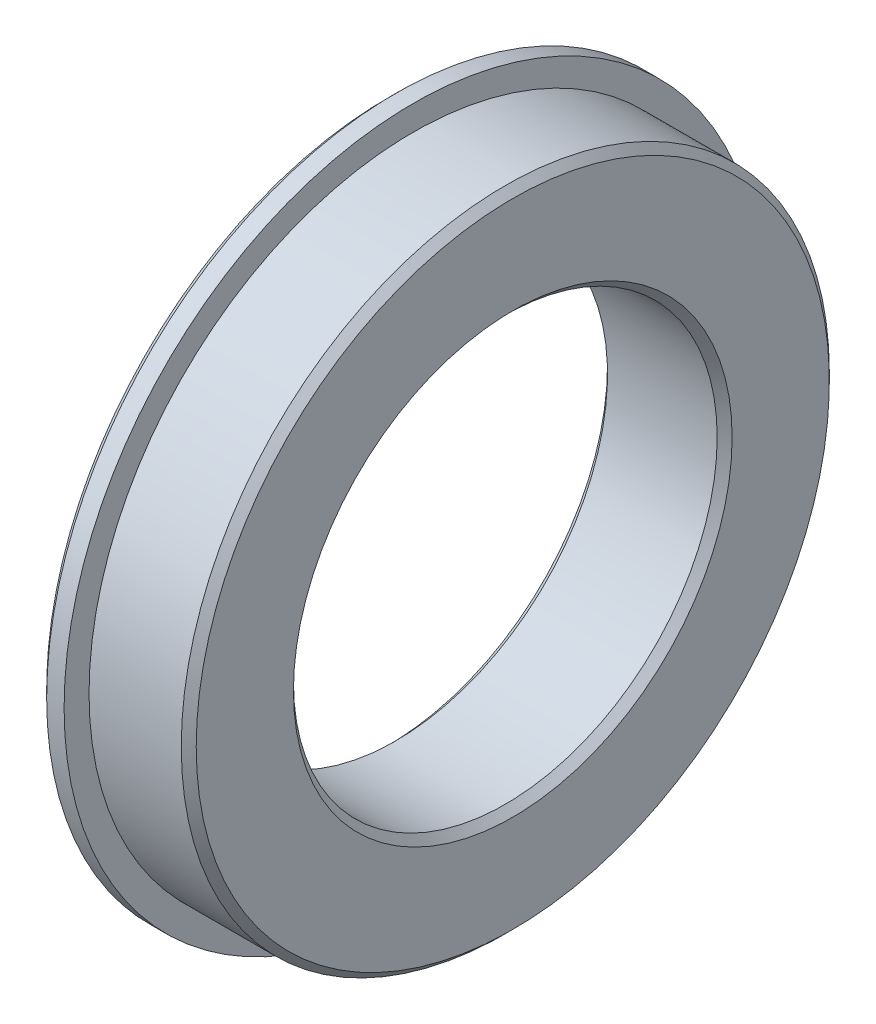
ISO-10303-21;
HEADER;
FILE_DESCRIPTION(('STEP AP214'),'2;1');
FILE_NAME('part.step','',(''),(''),'','','');
FILE_SCHEMA(('AUTOMOTIVE_DESIGN { 1 0 10303 214 1 1 1 1 }'));
ENDSEC;
DATA;
#1=APPLICATION_CONTEXT('core data for automotive mechanical design processes');
#2=APPLICATION_PROTOCOL_DEFINITION('international standard','automotive_design',2000,#1);
#3=PRODUCT_CONTEXT('',#1,'mechanical');
#4=PRODUCT('Part','Part','',(#3));
#5=PRODUCT_RELATED_PRODUCT_CATEGORY('part','',(#4));
#6=PRODUCT_DEFINITION_FORMATION('','',#4);
#7=PRODUCT_DEFINITION_CONTEXT('part definition',#1,'design');
#8=PRODUCT_DEFINITION('design','',#6,#7);
#9=PRODUCT_DEFINITION_SHAPE('','',#8);
#10=(LENGTH_UNIT() NAMED_UNIT(*) SI_UNIT(.MILLI.,.METRE.));
#11=(NAMED_UNIT(*) PLANE_ANGLE_UNIT() SI_UNIT($,.RADIAN.));
#12=(NAMED_UNIT(*) SI_UNIT($,.STERADIAN.) SOLID_ANGLE_UNIT());
#13=UNCERTAINTY_MEASURE_WITH_UNIT(LENGTH_MEASURE(1.E-05),#10,'distance_accuracy_value','');
#14=(GEOMETRIC_REPRESENTATION_CONTEXT(3) GLOBAL_UNCERTAINTY_ASSIGNED_CONTEXT((#13)) GLOBAL_UNIT_ASSIGNED_CONTEXT((#10,
#11,#12)) REPRESENTATION_CONTEXT('',''));
#15=CARTESIAN_POINT('',(0.,0.,0.));
#16=DIRECTION('',(0.,0.,1.));
#17=DIRECTION('',(1.,0.,0.));
#18=AXIS2_PLACEMENT_3D('',#15,#16,#17);
#19=CARTESIAN_POINT('',(5.,0.,0.));
#20=DIRECTION('',(1.,0.,0.));
#21=DIRECTION('',(0.,0.,-1.));
#22=AXIS2_PLACEMENT_3D('',#19,#20,#21);
#23=PLANE('',#22);
#24=CARTESIAN_POINT('',(5.,0.,0.));
#25=DIRECTION('',(1.,0.,0.));
#26=DIRECTION('',(0.,0.,-1.));
#27=AXIS2_PLACEMENT_3D('',#24,#25,#26);
#28=CIRCLE('',#27,12.7);
#29=CARTESIAN_POINT('',(5.,0.,12.7));
#30=VERTEX_POINT('',#29);
#31=EDGE_CURVE('E58',#30,#30,#28,.T.);
#32=ORIENTED_EDGE('',*,*,#31,.T.);
#33=EDGE_LOOP('',(#32));
#34=FACE_BOUND('',#33,.T.);
#35=CARTESIAN_POINT('',(5.,0.,0.));
#36=DIRECTION('',(1.,0.,0.));
#37=DIRECTION('',(0.,0.,-1.));
#38=AXIS2_PLACEMENT_3D('',#35,#36,#37);
#39=CIRCLE('',#38,8.80000000000001);
#40=CARTESIAN_POINT('',(5.,0.,-8.80000000000001));
#41=VERTEX_POINT('',#40);
#42=EDGE_CURVE('E61',#41,#41,#39,.F.);
#43=ORIENTED_EDGE('',*,*,#42,.T.);
#44=EDGE_LOOP('',(#43));
#45=FACE_BOUND('',#44,.T.);
#46=ADVANCED_FACE('F32',(#34,#45),#23,.T.);
#47=CARTESIAN_POINT('',(5.,0.,0.));
#48=DIRECTION('',(-1.,0.,0.));
#49=DIRECTION('',(0.,0.,1.));
#50=AXIS2_PLACEMENT_3D('',#47,#48,#49);
#51=CYLINDRICAL_SURFACE('',#50,14.);
#52=CARTESIAN_POINT('',(0.299999999999998,0.,0.));
#53=DIRECTION('',(1.,0.,0.));
#54=DIRECTION('',(0.,0.,-1.));
#55=AXIS2_PLACEMENT_3D('',#52,#53,#54);
#56=CIRCLE('',#55,14.);
#57=CARTESIAN_POINT('',(0.299999999999998,0.,-14.));
#58=VERTEX_POINT('',#57);
#59=EDGE_CURVE('E52',#58,#58,#56,.T.);
#60=ORIENTED_EDGE('',*,*,#59,.T.);
#61=EDGE_LOOP('',(#60));
#62=FACE_BOUND('',#61,.T.);
#63=CARTESIAN_POINT('',(1.,0.,0.));
#64=DIRECTION('',(1.,0.,0.));
#65=DIRECTION('',(0.,0.,-1.));
#66=AXIS2_PLACEMENT_3D('',#63,#64,#65);
#67=CIRCLE('',#66,14.);
#68=CARTESIAN_POINT('',(1.,0.,-14.));
#69=VERTEX_POINT('',#68);
#70=EDGE_CURVE('E64',#69,#69,#67,.T.);
#71=ORIENTED_EDGE('',*,*,#70,.F.);
#72=EDGE_LOOP('',(#71));
#73=FACE_BOUND('',#72,.T.);
#74=ADVANCED_FACE('F80',(#62,#73),#51,.T.);
#75=CARTESIAN_POINT('',(0.,0.,0.));
#76=DIRECTION('',(1.,0.,0.));
#77=DIRECTION('',(0.,0.,-1.));
#78=AXIS2_PLACEMENT_3D('',#75,#76,#77);
#79=PLANE('',#78);
#80=CARTESIAN_POINT('',(0.,0.,0.));
#81=DIRECTION('',(1.,0.,0.));
#82=DIRECTION('',(0.,0.,-1.));
#83=AXIS2_PLACEMENT_3D('',#80,#81,#82);
#84=CIRCLE('',#83,13.7);
#85=CARTESIAN_POINT('',(0.,0.,-13.7));
#86=VERTEX_POINT('',#85);
#87=EDGE_CURVE('E43',#86,#86,#84,.F.);
#88=ORIENTED_EDGE('',*,*,#87,.T.);
#89=EDGE_LOOP('',(#88));
#90=FACE_BOUND('',#89,.T.);
#91=CARTESIAN_POINT('',(0.,0.,0.));
#92=DIRECTION('',(1.,0.,0.));
#93=DIRECTION('',(0.,0.,-1.));
#94=AXIS2_PLACEMENT_3D('',#91,#92,#93);
#95=CIRCLE('',#94,8.8);
#96=CARTESIAN_POINT('',(0.,0.,8.8));
#97=VERTEX_POINT('',#96);
#98=EDGE_CURVE('E47',#97,#97,#95,.T.);
#99=ORIENTED_EDGE('',*,*,#98,.T.);
#100=EDGE_LOOP('',(#99));
#101=FACE_BOUND('',#100,.T.);
#102=ADVANCED_FACE('F82',(#90,#101),#79,.F.);
#103=CARTESIAN_POINT('',(5.,0.,0.));
#104=DIRECTION('',(-1.,0.,0.));
#105=DIRECTION('',(0.,0.,1.));
#106=AXIS2_PLACEMENT_3D('',#103,#104,#105);
#107=CYLINDRICAL_SURFACE('',#106,8.5);
#108=CARTESIAN_POINT('',(4.69999999999999,0.,0.));
#109=DIRECTION('',(1.,0.,0.));
#110=DIRECTION('',(0.,0.,-1.));
#111=AXIS2_PLACEMENT_3D('',#108,#109,#110);
#112=CIRCLE('',#111,8.5);
#113=CARTESIAN_POINT('',(4.69999999999999,0.,-8.5));
#114=VERTEX_POINT('',#113);
#115=EDGE_CURVE('E10',#114,#114,#112,.T.);
#116=ORIENTED_EDGE('',*,*,#115,.T.);
#117=EDGE_LOOP('',(#116));
#118=FACE_BOUND('',#117,.T.);
#119=CARTESIAN_POINT('',(0.300000000000005,0.,0.));
#120=DIRECTION('',(1.,0.,0.));
#121=DIRECTION('',(0.,0.,-1.));
#122=AXIS2_PLACEMENT_3D('',#119,#120,#121);
#123=CIRCLE('',#122,8.5);
#124=CARTESIAN_POINT('',(0.300000000000005,0.,8.5));
#125=VERTEX_POINT('',#124);
#126=EDGE_CURVE('E39',#125,#125,#123,.F.);
#127=ORIENTED_EDGE('',*,*,#126,.T.);
#128=EDGE_LOOP('',(#127));
#129=FACE_BOUND('',#128,.T.);
#130=ADVANCED_FACE('F76',(#118,#129),#107,.F.);
#131=CARTESIAN_POINT('',(1.,0.,0.));
#132=DIRECTION('',(1.,0.,0.));
#133=DIRECTION('',(0.,0.,-1.));
#134=AXIS2_PLACEMENT_3D('',#131,#132,#133);
#135=PLANE('',#134);
#136=CARTESIAN_POINT('',(1.,0.,0.));
#137=DIRECTION('',(1.,0.,0.));
#138=DIRECTION('',(0.,0.,-1.));
#139=AXIS2_PLACEMENT_3D('',#136,#137,#138);
#140=CIRCLE('',#139,13.);
#141=CARTESIAN_POINT('',(1.,0.,-13.));
#142=VERTEX_POINT('',#141);
#143=EDGE_CURVE('E67',#142,#142,#140,.T.);
#144=ORIENTED_EDGE('',*,*,#143,.F.);
#145=EDGE_LOOP('',(#144));
#146=FACE_BOUND('',#145,.T.);
#147=ORIENTED_EDGE('',*,*,#70,.T.);
#148=EDGE_LOOP('',(#147));
#149=FACE_BOUND('',#148,.T.);
#150=ADVANCED_FACE('F73',(#146,#149),#135,.T.);
#151=CARTESIAN_POINT('',(1.,0.,0.));
#152=DIRECTION('',(1.,0.,0.));
#153=DIRECTION('',(0.,0.,-1.));
#154=AXIS2_PLACEMENT_3D('',#151,#152,#153);
#155=CYLINDRICAL_SURFACE('',#154,13.);
#156=CARTESIAN_POINT('',(4.69999999999999,0.,0.));
#157=DIRECTION('',(1.,0.,0.));
#158=DIRECTION('',(0.,0.,-1.));
#159=AXIS2_PLACEMENT_3D('',#156,#157,#158);
#160=CIRCLE('',#159,13.);
#161=CARTESIAN_POINT('',(4.69999999999999,0.,13.));
#162=VERTEX_POINT('',#161);
#163=EDGE_CURVE('E55',#162,#162,#160,.F.);
#164=ORIENTED_EDGE('',*,*,#163,.T.);
#165=EDGE_LOOP('',(#164));
#166=FACE_BOUND('',#165,.T.);
#167=ORIENTED_EDGE('',*,*,#143,.T.);
#168=EDGE_LOOP('',(#167));
#169=FACE_BOUND('',#168,.T.);
#170=ADVANCED_FACE('F71',(#166,#169),#155,.T.);
#171=CARTESIAN_POINT('',(5.,0.,0.));
#172=DIRECTION('',(-1.,0.,0.));
#173=DIRECTION('',(0.,0.,1.));
#174=AXIS2_PLACEMENT_3D('',#171,#172,#173);
#175=CONICAL_SURFACE('',#174,12.7,0.785398163397451);
#176=CARTESIAN_POINT('',(4.69999999999999,0.,13.));
#177=CARTESIAN_POINT('',(4.703125,0.,12.996875));
#178=CARTESIAN_POINT('',(4.70625,0.,12.99375));
#179=CARTESIAN_POINT('',(4.71249999999999,0.,12.9875));
#180=CARTESIAN_POINT('',(4.71562499999999,0.,12.984375));
#181=CARTESIAN_POINT('',(4.721875,0.,12.978125));
#182=CARTESIAN_POINT('',(4.725,0.,12.975));
#183=CARTESIAN_POINT('',(4.73124999999999,0.,12.96875));
#184=CARTESIAN_POINT('',(4.734375,0.,12.965625));
#185=CARTESIAN_POINT('',(4.740625,0.,12.959375));
#186=CARTESIAN_POINT('',(4.74375,0.,12.95625));
#187=CARTESIAN_POINT('',(4.75,0.,12.95));
#188=CARTESIAN_POINT('',(4.753125,0.,12.946875));
#189=CARTESIAN_POINT('',(4.759375,0.,12.940625));
#190=CARTESIAN_POINT('',(4.7625,0.,12.9375));
#191=CARTESIAN_POINT('',(4.76875,0.,12.93125));
#192=CARTESIAN_POINT('',(4.771875,0.,12.928125));
#193=CARTESIAN_POINT('',(4.778125,0.,12.921875));
#194=CARTESIAN_POINT('',(4.78125,0.,12.91875));
#195=CARTESIAN_POINT('',(4.7875,0.,12.9125));
#196=CARTESIAN_POINT('',(4.790625,0.,12.909375));
#197=CARTESIAN_POINT('',(4.796875,0.,12.903125));
#198=CARTESIAN_POINT('',(4.8,0.,12.9));
#199=CARTESIAN_POINT('',(4.80625,0.,12.89375));
#200=CARTESIAN_POINT('',(4.809375,0.,12.890625));
#201=CARTESIAN_POINT('',(4.815625,0.,12.884375));
#202=CARTESIAN_POINT('',(4.81875,0.,12.88125));
#203=CARTESIAN_POINT('',(4.825,0.,12.875));
#204=CARTESIAN_POINT('',(4.828125,0.,12.871875));
#205=CARTESIAN_POINT('',(4.834375,0.,12.865625));
#206=CARTESIAN_POINT('',(4.8375,0.,12.8625));
#207=CARTESIAN_POINT('',(4.84375,0.,12.85625));
#208=CARTESIAN_POINT('',(4.846875,0.,12.853125));
#209=CARTESIAN_POINT('',(4.853125,0.,12.846875));
#210=CARTESIAN_POINT('',(4.85625,0.,12.84375));
#211=CARTESIAN_POINT('',(4.8625,0.,12.8375));
#212=CARTESIAN_POINT('',(4.865625,0.,12.834375));
#213=CARTESIAN_POINT('',(4.871875,0.,12.828125));
#214=CARTESIAN_POINT('',(4.875,0.,12.825));
#215=CARTESIAN_POINT('',(4.88125,0.,12.81875));
#216=CARTESIAN_POINT('',(4.884375,0.,12.815625));
#217=CARTESIAN_POINT('',(4.890625,0.,12.809375));
#218=CARTESIAN_POINT('',(4.89375,0.,12.80625));
#219=CARTESIAN_POINT('',(4.9,0.,12.8));
#220=CARTESIAN_POINT('',(4.903125,0.,12.796875));
#221=CARTESIAN_POINT('',(4.909375,0.,12.790625));
#222=CARTESIAN_POINT('',(4.9125,0.,12.7875));
#223=CARTESIAN_POINT('',(4.91875,0.,12.78125));
#224=CARTESIAN_POINT('',(4.921875,0.,12.778125));
#225=CARTESIAN_POINT('',(4.928125,0.,12.771875));
#226=CARTESIAN_POINT('',(4.93125,0.,12.76875));
#227=CARTESIAN_POINT('',(4.9375,0.,12.7625));
#228=CARTESIAN_POINT('',(4.940625,0.,12.759375));
#229=CARTESIAN_POINT('',(4.946875,0.,12.753125));
#230=CARTESIAN_POINT('',(4.95,0.,12.75));
#231=CARTESIAN_POINT('',(4.95625,0.,12.74375));
#232=CARTESIAN_POINT('',(4.959375,0.,12.740625));
#233=CARTESIAN_POINT('',(4.965625,0.,12.734375));
#234=CARTESIAN_POINT('',(4.96875,0.,12.73125));
#235=CARTESIAN_POINT('',(4.975,0.,12.725));
#236=CARTESIAN_POINT('',(4.978125,0.,12.721875));
#237=CARTESIAN_POINT('',(4.984375,0.,12.715625));
#238=CARTESIAN_POINT('',(4.9875,0.,12.7125));
#239=CARTESIAN_POINT('',(4.99375,0.,12.70625));
#240=CARTESIAN_POINT('',(4.996875,0.,12.703125));
#241=CARTESIAN_POINT('',(5.,0.,12.7));
#242=B_SPLINE_CURVE_WITH_KNOTS('',3,(#176,#177,#178,#179,#180,#181,#182,#183,#184,#185,#186,
#187,#188,#189,#190,#191,#192,#193,#194,#195,#196,#197,#198,#199,#200,#201,#202,#203,#204,#205,
#206,#207,#208,#209,#210,#211,#212,#213,#214,#215,#216,#217,#218,#219,#220,#221,#222,#223,#224,
#225,#226,#227,#228,#229,#230,#231,#232,#233,#234,#235,#236,#237,#238,#239,#240,#241),
.UNSPECIFIED.,.F.,.F.,(4,2,2,2,2,2,2,2,2,2,2,2,2,2,2,2,2,2,2,2,2,2,2,2,2,2,2,2,2,2,2,2,4),(0.,
0.0132582521472469,0.0265165042944951,0.0397747564417438,0.053033008588992,0.0662912607362389,
0.0795495128834876,0.0928077650307358,0.106066017177985,0.119324269325231,0.13258252147248,
0.145840773619728,0.159099025766975,0.172357277914223,0.185615530061472,0.19887378220872,
0.212132034355968,0.225390286503216,0.238648538650464,0.251906790797712,0.26516504294496,
0.278423295092208,0.291681547239457,0.304939799386704,0.318198051533952,0.331456303681201,
0.344714555828448,0.357972807975696,0.371231060122944,0.384489312270193,0.39774756441744,
0.411005816564688,0.424264068711937),.UNSPECIFIED.);
#243=EDGE_CURVE('BSEAM94',#162,#30,#242,.T.);
#244=ORIENTED_EDGE('',*,*,#163,.F.);
#245=ORIENTED_EDGE('',*,*,#31,.F.);
#246=ORIENTED_EDGE('',*,*,#243,.T.);
#247=ORIENTED_EDGE('',*,*,#243,.F.);
#248=EDGE_LOOP('',(#244,#246,#245,#247));
#249=FACE_BOUND('',#248,.T.);
#250=ADVANCED_FACE('F94',(#249),#175,.T.);
#251=CARTESIAN_POINT('',(0.299999999999998,0.,0.));
#252=DIRECTION('',(1.,0.,0.));
#253=DIRECTION('',(0.,0.,-1.));
#254=AXIS2_PLACEMENT_3D('',#251,#252,#253);
#255=CONICAL_SURFACE('',#254,14.,0.785398163397451);
#256=ORIENTED_EDGE('',*,*,#87,.F.);
#257=EDGE_LOOP('',(#256));
#258=FACE_BOUND('',#257,.T.);
#259=ORIENTED_EDGE('',*,*,#59,.F.);
#260=EDGE_LOOP('',(#259));
#261=FACE_BOUND('',#260,.T.);
#262=ADVANCED_FACE('F97',(#258,#261),#255,.T.);
#263=CARTESIAN_POINT('',(4.69999999999999,0.,0.));
#264=DIRECTION('',(1.,0.,0.));
#265=DIRECTION('',(0.,0.,-1.));
#266=AXIS2_PLACEMENT_3D('',#263,#264,#265);
#267=CONICAL_SURFACE('',#266,8.5,0.785398163397451);
#268=ORIENTED_EDGE('',*,*,#42,.F.);
#269=EDGE_LOOP('',(#268));
#270=FACE_BOUND('',#269,.T.);
#271=ORIENTED_EDGE('',*,*,#115,.F.);
#272=EDGE_LOOP('',(#271));
#273=FACE_BOUND('',#272,.T.);
#274=ADVANCED_FACE('F100',(#270,#273),#267,.F.);
#275=CARTESIAN_POINT('',(0.,0.,0.));
#276=DIRECTION('',(-1.,0.,0.));
#277=DIRECTION('',(0.,0.,1.));
#278=AXIS2_PLACEMENT_3D('',#275,#276,#277);
#279=CONICAL_SURFACE('',#278,8.8,0.785398163397443);
#280=CARTESIAN_POINT('',(0.300000000000005,0.,8.5));
#281=CARTESIAN_POINT('',(0.296875000000005,0.,8.503125));
#282=CARTESIAN_POINT('',(0.293750000000005,0.,8.50625));
#283=CARTESIAN_POINT('',(0.287500000000005,0.,8.5125));
#284=CARTESIAN_POINT('',(0.284375000000005,0.,8.515625));
#285=CARTESIAN_POINT('',(0.278125000000005,0.,8.521875));
#286=CARTESIAN_POINT('',(0.275000000000005,0.,8.525));
#287=CARTESIAN_POINT('',(0.268750000000005,0.,8.53125));
#288=CARTESIAN_POINT('',(0.265625000000004,0.,8.534375));
#289=CARTESIAN_POINT('',(0.259375000000004,0.,8.540625));
#290=CARTESIAN_POINT('',(0.256250000000004,0.,8.54375));
#291=CARTESIAN_POINT('',(0.250000000000004,0.,8.55));
#292=CARTESIAN_POINT('',(0.246875000000004,0.,8.553125));
#293=CARTESIAN_POINT('',(0.240625000000004,0.,8.559375));
#294=CARTESIAN_POINT('',(0.237500000000004,0.,8.5625));
#295=CARTESIAN_POINT('',(0.231250000000004,0.,8.56875));
#296=CARTESIAN_POINT('',(0.228125000000004,0.,8.571875));
#297=CARTESIAN_POINT('',(0.221875000000004,0.,8.578125));
#298=CARTESIAN_POINT('',(0.218750000000004,0.,8.58125));
#299=CARTESIAN_POINT('',(0.212500000000004,0.,8.5875));
#300=CARTESIAN_POINT('',(0.209375000000003,0.,8.590625));
#301=CARTESIAN_POINT('',(0.203125000000003,0.,8.596875));
#302=CARTESIAN_POINT('',(0.200000000000003,0.,8.6));
#303=CARTESIAN_POINT('',(0.193750000000003,0.,8.60625));
#304=CARTESIAN_POINT('',(0.190625000000003,0.,8.609375));
#305=CARTESIAN_POINT('',(0.184375000000003,0.,8.615625));
#306=CARTESIAN_POINT('',(0.181250000000003,0.,8.61875));
#307=CARTESIAN_POINT('',(0.175000000000003,0.,8.625));
#308=CARTESIAN_POINT('',(0.171875000000003,0.,8.628125));
#309=CARTESIAN_POINT('',(0.165625000000003,0.,8.634375));
#310=CARTESIAN_POINT('',(0.162500000000003,0.,8.6375));
#311=CARTESIAN_POINT('',(0.156250000000002,0.,8.64375));
#312=CARTESIAN_POINT('',(0.153125000000002,0.,8.646875));
#313=CARTESIAN_POINT('',(0.146875000000003,0.,8.653125));
#314=CARTESIAN_POINT('',(0.143750000000003,0.,8.65625));
#315=CARTESIAN_POINT('',(0.137500000000002,0.,8.6625));
#316=CARTESIAN_POINT('',(0.134375000000002,0.,8.665625));
#317=CARTESIAN_POINT('',(0.128125000000002,0.,8.671875));
#318=CARTESIAN_POINT('',(0.125000000000002,0.,8.675));
#319=CARTESIAN_POINT('',(0.118750000000002,0.,8.68125));
#320=CARTESIAN_POINT('',(0.115625000000002,0.,8.684375));
#321=CARTESIAN_POINT('',(0.109375000000002,0.,8.690625));
#322=CARTESIAN_POINT('',(0.106250000000002,0.,8.69375));
#323=CARTESIAN_POINT('',(0.100000000000002,0.,8.7));
#324=CARTESIAN_POINT('',(0.0968750000000018,0.,8.703125));
#325=CARTESIAN_POINT('',(0.0906250000000017,0.,8.709375));
#326=CARTESIAN_POINT('',(0.0875000000000014,0.,8.7125));
#327=CARTESIAN_POINT('',(0.0812500000000012,0.,8.71875));
#328=CARTESIAN_POINT('',(0.0781250000000012,0.,8.721875));
#329=CARTESIAN_POINT('',(0.0718750000000013,0.,8.728125));
#330=CARTESIAN_POINT('',(0.0687500000000014,0.,8.73125));
#331=CARTESIAN_POINT('',(0.0625000000000012,0.,8.7375));
#332=CARTESIAN_POINT('',(0.0593750000000009,0.,8.740625));
#333=CARTESIAN_POINT('',(0.0531250000000007,0.,8.746875));
#334=CARTESIAN_POINT('',(0.0500000000000007,0.,8.75));
#335=CARTESIAN_POINT('',(0.0437500000000008,0.,8.75625));
#336=CARTESIAN_POINT('',(0.0406250000000009,0.,8.759375));
#337=CARTESIAN_POINT('',(0.0343750000000007,0.,8.765625));
#338=CARTESIAN_POINT('',(0.0312500000000004,0.,8.76875));
#339=CARTESIAN_POINT('',(0.0250000000000003,0.,8.775));
#340=CARTESIAN_POINT('',(0.0218750000000005,0.,8.778125));
#341=CARTESIAN_POINT('',(0.0156250000000004,0.,8.784375));
#342=CARTESIAN_POINT('',(0.0125000000000002,0.,8.7875));
#343=CARTESIAN_POINT('',(0.0062499999999998,0.,8.79375));
#344=CARTESIAN_POINT('',(0.00312499999999958,0.,8.796875));
#345=CARTESIAN_POINT('',(0.,0.,8.8));
#346=B_SPLINE_CURVE_WITH_KNOTS('',3,(#280,#281,#282,#283,#284,#285,#286,#287,#288,#289,#290,
#291,#292,#293,#294,#295,#296,#297,#298,#299,#300,#301,#302,#303,#304,#305,#306,#307,#308,#309,
#310,#311,#312,#313,#314,#315,#316,#317,#318,#319,#320,#321,#322,#323,#324,#325,#326,#327,#328,
#329,#330,#331,#332,#333,#334,#335,#336,#337,#338,#339,#340,#341,#342,#343,#344,#345),
.UNSPECIFIED.,.F.,.F.,(4,2,2,2,2,2,2,2,2,2,2,2,2,2,2,2,2,2,2,2,2,2,2,2,2,2,2,2,2,2,2,2,4),(0.,
0.0132582521472484,0.0265165042944955,0.0397747564417439,0.053033008588991,0.0662912607362394,
0.0795495128834878,0.0928077650307349,0.106066017177983,0.119324269325232,0.132582521472479,
0.145840773619727,0.159099025766976,0.172357277914223,0.185615530061471,0.198873782208718,
0.212132034355967,0.225390286503215,0.238648538650462,0.251906790797711,0.265165042944959,
0.278423295092206,0.291681547239454,0.304939799386702,0.31819805153395,0.331456303681198,
0.344714555828446,0.357972807975694,0.371231060122942,0.384489312270189,0.397747564417438,
0.411005816564685,0.424264068711933),.UNSPECIFIED.);
#347=EDGE_CURVE('BSEAM34',#125,#97,#346,.T.);
#348=ORIENTED_EDGE('',*,*,#126,.F.);
#349=ORIENTED_EDGE('',*,*,#98,.F.);
#350=ORIENTED_EDGE('',*,*,#347,.T.);
#351=ORIENTED_EDGE('',*,*,#347,.F.);
#352=EDGE_LOOP('',(#348,#350,#349,#351));
#353=FACE_BOUND('',#352,.T.);
#354=ADVANCED_FACE('F34',(#353),#279,.F.);
#355=CLOSED_SHELL('',(#46,#74,#102,#130,#150,#170,#250,#262,#274,#354));
#356=MANIFOLD_SOLID_BREP('B2',#355);
#357=ADVANCED_BREP_SHAPE_REPRESENTATION('',(#18,#356),#14);
#358=SHAPE_DEFINITION_REPRESENTATION(#9,#357);
ENDSEC;
END-ISO-10303-21;
